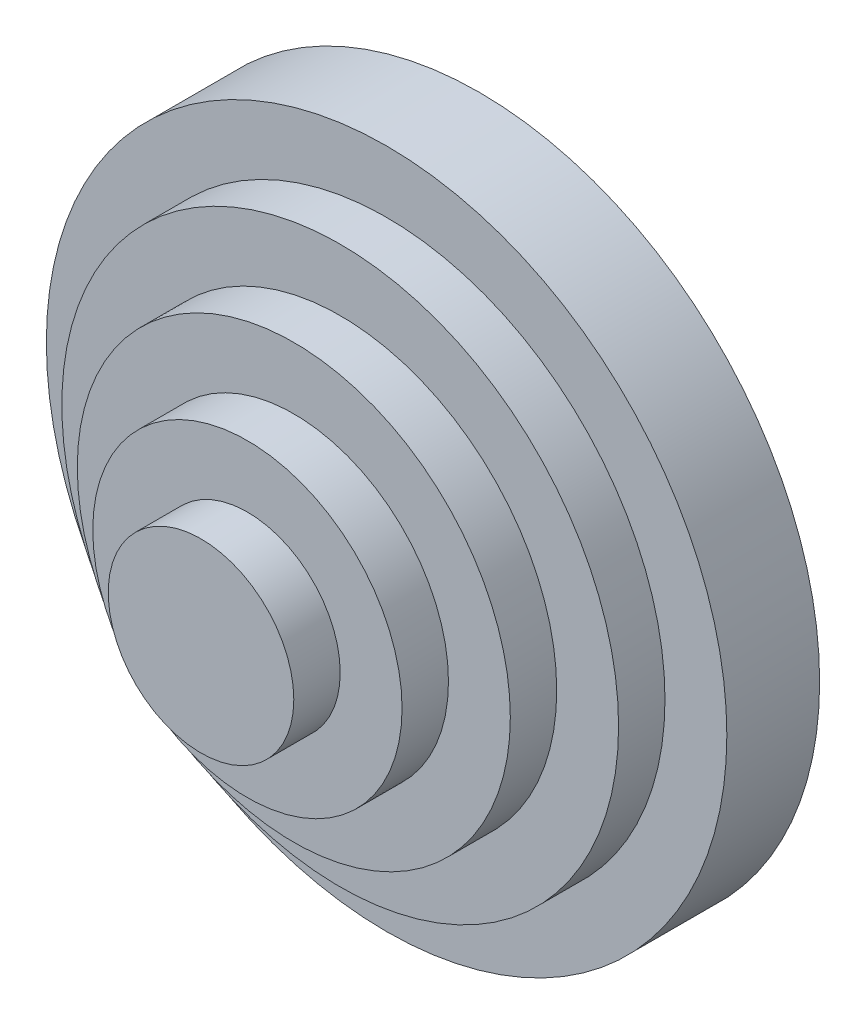
ISO-10303-21;
HEADER;
FILE_DESCRIPTION(('STEP AP214'),'2;1');
FILE_NAME('part.step','',(''),(''),'','','');
FILE_SCHEMA(('AUTOMOTIVE_DESIGN { 1 0 10303 214 1 1 1 1 }'));
ENDSEC;
DATA;
#1=APPLICATION_CONTEXT('core data for automotive mechanical design processes');
#2=APPLICATION_PROTOCOL_DEFINITION('international standard','automotive_design',2000,#1);
#3=PRODUCT_CONTEXT('',#1,'mechanical');
#4=PRODUCT('Part','Part','',(#3));
#5=PRODUCT_RELATED_PRODUCT_CATEGORY('part','',(#4));
#6=PRODUCT_DEFINITION_FORMATION('','',#4);
#7=PRODUCT_DEFINITION_CONTEXT('part definition',#1,'design');
#8=PRODUCT_DEFINITION('design','',#6,#7);
#9=PRODUCT_DEFINITION_SHAPE('','',#8);
#10=(LENGTH_UNIT() NAMED_UNIT(*) SI_UNIT(.MILLI.,.METRE.));
#11=(NAMED_UNIT(*) PLANE_ANGLE_UNIT() SI_UNIT($,.RADIAN.));
#12=(NAMED_UNIT(*) SI_UNIT($,.STERADIAN.) SOLID_ANGLE_UNIT());
#13=UNCERTAINTY_MEASURE_WITH_UNIT(LENGTH_MEASURE(1.E-05),#10,'distance_accuracy_value','');
#14=(GEOMETRIC_REPRESENTATION_CONTEXT(3) GLOBAL_UNCERTAINTY_ASSIGNED_CONTEXT((#13)) GLOBAL_UNIT_ASSIGNED_CONTEXT((#10,
#11,#12)) REPRESENTATION_CONTEXT('',''));
#15=CARTESIAN_POINT('',(0.,0.,0.));
#16=DIRECTION('',(0.,0.,1.));
#17=DIRECTION('',(1.,0.,0.));
#18=AXIS2_PLACEMENT_3D('',#15,#16,#17);
#19=CARTESIAN_POINT('',(0.,0.,-3.));
#20=DIRECTION('',(0.,0.,1.));
#21=DIRECTION('',(1.,0.,0.));
#22=AXIS2_PLACEMENT_3D('',#19,#20,#21);
#23=CYLINDRICAL_SURFACE('',#22,11.);
#24=CARTESIAN_POINT('',(0.,0.,-3.));
#25=DIRECTION('',(0.,0.,1.));
#26=DIRECTION('',(1.,0.,0.));
#27=AXIS2_PLACEMENT_3D('',#24,#25,#26);
#28=CIRCLE('',#27,11.);
#29=CARTESIAN_POINT('',(11.,0.,-3.));
#30=VERTEX_POINT('',#29);
#31=EDGE_CURVE('E163',#30,#30,#28,.T.);
#32=ORIENTED_EDGE('',*,*,#31,.T.);
#33=EDGE_LOOP('',(#32));
#34=FACE_BOUND('',#33,.T.);
#35=CARTESIAN_POINT('',(0.,0.,0.));
#36=DIRECTION('',(0.,0.,1.));
#37=DIRECTION('',(1.,0.,0.));
#38=AXIS2_PLACEMENT_3D('',#35,#36,#37);
#39=CIRCLE('',#38,11.);
#40=CARTESIAN_POINT('',(11.,0.,0.));
#41=VERTEX_POINT('',#40);
#42=EDGE_CURVE('E38',#41,#41,#39,.T.);
#43=ORIENTED_EDGE('',*,*,#42,.F.);
#44=EDGE_LOOP('',(#43));
#45=FACE_BOUND('',#44,.T.);
#46=ADVANCED_FACE('F35',(#34,#45),#23,.T.);
#47=CARTESIAN_POINT('',(0.,0.,-3.));
#48=DIRECTION('',(0.,0.,1.));
#49=DIRECTION('',(1.,0.,0.));
#50=AXIS2_PLACEMENT_3D('',#47,#48,#49);
#51=PLANE('',#50);
#52=DIRECTION('',(0.,1.,0.));
#53=VECTOR('',#52,1.);
#54=CARTESIAN_POINT('',(4.7,-2.22485954612874,-3.));
#55=LINE('',#54,#53);
#56=CARTESIAN_POINT('',(4.7,-2.22485954612874,-3.));
#57=VERTEX_POINT('',#56);
#58=CARTESIAN_POINT('',(4.7,2.22485954612874,-3.));
#59=VERTEX_POINT('',#58);
#60=EDGE_CURVE('E119',#57,#59,#55,.T.);
#61=ORIENTED_EDGE('',*,*,#60,.T.);
#62=CARTESIAN_POINT('',(0.,0.,-3.));
#63=DIRECTION('',(0.,0.,1.));
#64=DIRECTION('',(1.,0.,0.));
#65=AXIS2_PLACEMENT_3D('',#62,#63,#64);
#66=CIRCLE('',#65,5.20000000000002);
#67=CARTESIAN_POINT('',(2.22485954612874,4.7,-3.));
#68=VERTEX_POINT('',#67);
#69=EDGE_CURVE('E150',#59,#68,#66,.T.);
#70=ORIENTED_EDGE('',*,*,#69,.T.);
#71=DIRECTION('',(-1.,0.,0.));
#72=VECTOR('',#71,1.);
#73=CARTESIAN_POINT('',(2.22485954612874,4.7,-3.));
#74=LINE('',#73,#72);
#75=CARTESIAN_POINT('',(-2.22485954612874,4.7,-3.));
#76=VERTEX_POINT('',#75);
#77=EDGE_CURVE('E267',#68,#76,#74,.T.);
#78=ORIENTED_EDGE('',*,*,#77,.T.);
#79=CARTESIAN_POINT('',(0.,0.,-3.));
#80=DIRECTION('',(0.,0.,1.));
#81=DIRECTION('',(1.,0.,0.));
#82=AXIS2_PLACEMENT_3D('',#79,#80,#81);
#83=CIRCLE('',#82,5.20000000000002);
#84=CARTESIAN_POINT('',(-4.7,2.22485954612874,-3.));
#85=VERTEX_POINT('',#84);
#86=EDGE_CURVE('E51',#76,#85,#83,.T.);
#87=ORIENTED_EDGE('',*,*,#86,.T.);
#88=DIRECTION('',(0.,-1.,0.));
#89=VECTOR('',#88,1.);
#90=CARTESIAN_POINT('',(-4.7,2.22485954612874,-3.));
#91=LINE('',#90,#89);
#92=CARTESIAN_POINT('',(-4.7,-2.22485954612874,-3.));
#93=VERTEX_POINT('',#92);
#94=EDGE_CURVE('E127',#85,#93,#91,.T.);
#95=ORIENTED_EDGE('',*,*,#94,.T.);
#96=CARTESIAN_POINT('',(0.,0.,-3.));
#97=DIRECTION('',(0.,0.,1.));
#98=DIRECTION('',(1.,0.,0.));
#99=AXIS2_PLACEMENT_3D('',#96,#97,#98);
#100=CIRCLE('',#99,5.20000000000002);
#101=CARTESIAN_POINT('',(-2.22485954612874,-4.7,-3.));
#102=VERTEX_POINT('',#101);
#103=EDGE_CURVE('E125',#93,#102,#100,.T.);
#104=ORIENTED_EDGE('',*,*,#103,.T.);
#105=DIRECTION('',(1.,0.,0.));
#106=VECTOR('',#105,1.);
#107=CARTESIAN_POINT('',(-2.22485954612874,-4.7,-3.));
#108=LINE('',#107,#106);
#109=CARTESIAN_POINT('',(2.22485954612874,-4.7,-3.));
#110=VERTEX_POINT('',#109);
#111=EDGE_CURVE('E104',#102,#110,#108,.T.);
#112=ORIENTED_EDGE('',*,*,#111,.T.);
#113=CARTESIAN_POINT('',(0.,0.,-3.));
#114=DIRECTION('',(0.,0.,1.));
#115=DIRECTION('',(1.,0.,0.));
#116=AXIS2_PLACEMENT_3D('',#113,#114,#115);
#117=CIRCLE('',#116,5.20000000000002);
#118=EDGE_CURVE('E114',#110,#57,#117,.T.);
#119=ORIENTED_EDGE('',*,*,#118,.T.);
#120=EDGE_LOOP('',(#61,#70,#78,#87,#95,#104,#112,#119));
#121=FACE_BOUND('',#120,.T.);
#122=ORIENTED_EDGE('',*,*,#31,.F.);
#123=EDGE_LOOP('',(#122));
#124=FACE_BOUND('',#123,.T.);
#125=ADVANCED_FACE('F121',(#121,#124),#51,.F.);
#126=CARTESIAN_POINT('',(0.,0.,0.));
#127=DIRECTION('',(0.,0.,1.));
#128=DIRECTION('',(1.,0.,0.));
#129=AXIS2_PLACEMENT_3D('',#126,#127,#128);
#130=PLANE('',#129);
#131=CARTESIAN_POINT('',(0.,0.,0.));
#132=DIRECTION('',(0.,0.,1.));
#133=DIRECTION('',(1.,0.,0.));
#134=AXIS2_PLACEMENT_3D('',#131,#132,#133);
#135=CIRCLE('',#134,9.);
#136=CARTESIAN_POINT('',(9.,0.,0.));
#137=VERTEX_POINT('',#136);
#138=EDGE_CURVE('E165',#137,#137,#135,.T.);
#139=ORIENTED_EDGE('',*,*,#138,.F.);
#140=EDGE_LOOP('',(#139));
#141=FACE_BOUND('',#140,.T.);
#142=ORIENTED_EDGE('',*,*,#42,.T.);
#143=EDGE_LOOP('',(#142));
#144=FACE_BOUND('',#143,.T.);
#145=ADVANCED_FACE('F174',(#141,#144),#130,.T.);
#146=CARTESIAN_POINT('',(0.,0.,-3.));
#147=DIRECTION('',(0.,0.,1.));
#148=DIRECTION('',(1.,0.,0.));
#149=AXIS2_PLACEMENT_3D('',#146,#147,#148);
#150=CYLINDRICAL_SURFACE('',#149,5.20000000000002);
#151=CARTESIAN_POINT('',(0.,0.,0.));
#152=DIRECTION('',(0.,0.,1.));
#153=DIRECTION('',(1.,0.,0.));
#154=AXIS2_PLACEMENT_3D('',#151,#152,#153);
#155=CIRCLE('',#154,5.20000000000002);
#156=CARTESIAN_POINT('',(4.7,2.22485954612874,0.));
#157=VERTEX_POINT('',#156);
#158=CARTESIAN_POINT('',(2.22485954612874,4.7,0.));
#159=VERTEX_POINT('',#158);
#160=EDGE_CURVE('E83',#157,#159,#155,.T.);
#161=ORIENTED_EDGE('',*,*,#160,.T.);
#162=DIRECTION('',(0.,0.,1.));
#163=VECTOR('',#162,1.);
#164=CARTESIAN_POINT('',(2.22485954612874,4.7,-3.));
#165=LINE('',#164,#163);
#166=EDGE_CURVE('E132',#68,#159,#165,.T.);
#167=ORIENTED_EDGE('',*,*,#166,.F.);
#168=ORIENTED_EDGE('',*,*,#69,.F.);
#169=DIRECTION('',(0.,0.,1.));
#170=VECTOR('',#169,1.);
#171=CARTESIAN_POINT('',(4.7,2.22485954612874,-3.));
#172=LINE('',#171,#170);
#173=EDGE_CURVE('E60',#59,#157,#172,.T.);
#174=ORIENTED_EDGE('',*,*,#173,.T.);
#175=EDGE_LOOP('',(#161,#167,#168,#174));
#176=FACE_BOUND('',#175,.T.);
#177=ADVANCED_FACE('F184',(#176),#150,.F.);
#178=CARTESIAN_POINT('',(4.7,-2.22485954612874,-3.));
#179=DIRECTION('',(1.,0.,0.));
#180=DIRECTION('',(0.,1.,0.));
#181=AXIS2_PLACEMENT_3D('',#178,#179,#180);
#182=PLANE('',#181);
#183=DIRECTION('',(0.,1.,0.));
#184=VECTOR('',#183,1.);
#185=CARTESIAN_POINT('',(4.7,-2.22485954612874,0.));
#186=LINE('',#185,#184);
#187=CARTESIAN_POINT('',(4.7,-2.22485954612874,0.));
#188=VERTEX_POINT('',#187);
#189=EDGE_CURVE('E148',#188,#157,#186,.T.);
#190=ORIENTED_EDGE('',*,*,#189,.T.);
#191=ORIENTED_EDGE('',*,*,#173,.F.);
#192=ORIENTED_EDGE('',*,*,#60,.F.);
#193=DIRECTION('',(0.,0.,1.));
#194=VECTOR('',#193,1.);
#195=CARTESIAN_POINT('',(4.7,-2.22485954612874,-3.));
#196=LINE('',#195,#194);
#197=EDGE_CURVE('E110',#57,#188,#196,.T.);
#198=ORIENTED_EDGE('',*,*,#197,.T.);
#199=EDGE_LOOP('',(#190,#191,#192,#198));
#200=FACE_BOUND('',#199,.T.);
#201=ADVANCED_FACE('F189',(#200),#182,.F.);
#202=CARTESIAN_POINT('',(0.,0.,-3.));
#203=DIRECTION('',(0.,0.,1.));
#204=DIRECTION('',(1.,0.,0.));
#205=AXIS2_PLACEMENT_3D('',#202,#203,#204);
#206=CYLINDRICAL_SURFACE('',#205,5.20000000000002);
#207=CARTESIAN_POINT('',(0.,0.,0.));
#208=DIRECTION('',(0.,0.,1.));
#209=DIRECTION('',(1.,0.,0.));
#210=AXIS2_PLACEMENT_3D('',#207,#208,#209);
#211=CIRCLE('',#210,5.20000000000002);
#212=CARTESIAN_POINT('',(2.22485954612874,-4.7,0.));
#213=VERTEX_POINT('',#212);
#214=EDGE_CURVE('E146',#213,#188,#211,.T.);
#215=ORIENTED_EDGE('',*,*,#214,.T.);
#216=ORIENTED_EDGE('',*,*,#197,.F.);
#217=ORIENTED_EDGE('',*,*,#118,.F.);
#218=DIRECTION('',(0.,0.,1.));
#219=VECTOR('',#218,1.);
#220=CARTESIAN_POINT('',(2.22485954612874,-4.7,-3.));
#221=LINE('',#220,#219);
#222=EDGE_CURVE('E99',#110,#213,#221,.T.);
#223=ORIENTED_EDGE('',*,*,#222,.T.);
#224=EDGE_LOOP('',(#215,#216,#217,#223));
#225=FACE_BOUND('',#224,.T.);
#226=ADVANCED_FACE('F115',(#225),#206,.F.);
#227=CARTESIAN_POINT('',(-2.22485954612874,-4.7,-3.));
#228=DIRECTION('',(0.,-1.,0.));
#229=DIRECTION('',(1.,0.,0.));
#230=AXIS2_PLACEMENT_3D('',#227,#228,#229);
#231=PLANE('',#230);
#232=DIRECTION('',(1.,0.,0.));
#233=VECTOR('',#232,1.);
#234=CARTESIAN_POINT('',(-2.22485954612874,-4.7,0.));
#235=LINE('',#234,#233);
#236=CARTESIAN_POINT('',(-2.22485954612874,-4.7,0.));
#237=VERTEX_POINT('',#236);
#238=EDGE_CURVE('E107',#237,#213,#235,.T.);
#239=ORIENTED_EDGE('',*,*,#238,.T.);
#240=ORIENTED_EDGE('',*,*,#222,.F.);
#241=ORIENTED_EDGE('',*,*,#111,.F.);
#242=DIRECTION('',(0.,0.,1.));
#243=VECTOR('',#242,1.);
#244=CARTESIAN_POINT('',(-2.22485954612874,-4.7,-3.));
#245=LINE('',#244,#243);
#246=EDGE_CURVE('E111',#102,#237,#245,.T.);
#247=ORIENTED_EDGE('',*,*,#246,.T.);
#248=EDGE_LOOP('',(#239,#240,#241,#247));
#249=FACE_BOUND('',#248,.T.);
#250=ADVANCED_FACE('F101',(#249),#231,.F.);
#251=CARTESIAN_POINT('',(0.,0.,-3.));
#252=DIRECTION('',(0.,0.,1.));
#253=DIRECTION('',(1.,0.,0.));
#254=AXIS2_PLACEMENT_3D('',#251,#252,#253);
#255=CYLINDRICAL_SURFACE('',#254,5.20000000000002);
#256=CARTESIAN_POINT('',(0.,0.,0.));
#257=DIRECTION('',(0.,0.,1.));
#258=DIRECTION('',(1.,0.,0.));
#259=AXIS2_PLACEMENT_3D('',#256,#257,#258);
#260=CIRCLE('',#259,5.20000000000002);
#261=CARTESIAN_POINT('',(-4.7,-2.22485954612874,0.));
#262=VERTEX_POINT('',#261);
#263=EDGE_CURVE('E142',#262,#237,#260,.T.);
#264=ORIENTED_EDGE('',*,*,#263,.T.);
#265=ORIENTED_EDGE('',*,*,#246,.F.);
#266=ORIENTED_EDGE('',*,*,#103,.F.);
#267=DIRECTION('',(0.,0.,1.));
#268=VECTOR('',#267,1.);
#269=CARTESIAN_POINT('',(-4.7,-2.22485954612874,-3.));
#270=LINE('',#269,#268);
#271=EDGE_CURVE('E154',#93,#262,#270,.T.);
#272=ORIENTED_EDGE('',*,*,#271,.T.);
#273=EDGE_LOOP('',(#264,#265,#266,#272));
#274=FACE_BOUND('',#273,.T.);
#275=ADVANCED_FACE('F202',(#274),#255,.F.);
#276=CARTESIAN_POINT('',(-4.7,2.22485954612874,-3.));
#277=DIRECTION('',(-1.,0.,0.));
#278=DIRECTION('',(0.,0.,1.));
#279=AXIS2_PLACEMENT_3D('',#276,#277,#278);
#280=PLANE('',#279);
#281=DIRECTION('',(0.,-1.,0.));
#282=VECTOR('',#281,1.);
#283=CARTESIAN_POINT('',(-4.7,2.22485954612874,0.));
#284=LINE('',#283,#282);
#285=CARTESIAN_POINT('',(-4.7,2.22485954612874,0.));
#286=VERTEX_POINT('',#285);
#287=EDGE_CURVE('E139',#286,#262,#284,.T.);
#288=ORIENTED_EDGE('',*,*,#287,.T.);
#289=ORIENTED_EDGE('',*,*,#271,.F.);
#290=ORIENTED_EDGE('',*,*,#94,.F.);
#291=DIRECTION('',(0.,0.,1.));
#292=VECTOR('',#291,1.);
#293=CARTESIAN_POINT('',(-4.7,2.22485954612874,-3.));
#294=LINE('',#293,#292);
#295=EDGE_CURVE('E157',#85,#286,#294,.T.);
#296=ORIENTED_EDGE('',*,*,#295,.T.);
#297=EDGE_LOOP('',(#288,#289,#290,#296));
#298=FACE_BOUND('',#297,.T.);
#299=ADVANCED_FACE('F199',(#298),#280,.F.);
#300=CARTESIAN_POINT('',(0.,0.,-3.));
#301=DIRECTION('',(0.,0.,1.));
#302=DIRECTION('',(1.,0.,0.));
#303=AXIS2_PLACEMENT_3D('',#300,#301,#302);
#304=CYLINDRICAL_SURFACE('',#303,5.20000000000002);
#305=CARTESIAN_POINT('',(0.,0.,0.));
#306=DIRECTION('',(0.,0.,1.));
#307=DIRECTION('',(1.,0.,0.));
#308=AXIS2_PLACEMENT_3D('',#305,#306,#307);
#309=CIRCLE('',#308,5.20000000000002);
#310=CARTESIAN_POINT('',(-2.22485954612874,4.7,0.));
#311=VERTEX_POINT('',#310);
#312=EDGE_CURVE('E74',#311,#286,#309,.T.);
#313=ORIENTED_EDGE('',*,*,#312,.T.);
#314=ORIENTED_EDGE('',*,*,#295,.F.);
#315=ORIENTED_EDGE('',*,*,#86,.F.);
#316=DIRECTION('',(0.,0.,1.));
#317=VECTOR('',#316,1.);
#318=CARTESIAN_POINT('',(-2.22485954612874,4.7,-3.));
#319=LINE('',#318,#317);
#320=EDGE_CURVE('E160',#76,#311,#319,.T.);
#321=ORIENTED_EDGE('',*,*,#320,.T.);
#322=EDGE_LOOP('',(#313,#314,#315,#321));
#323=FACE_BOUND('',#322,.T.);
#324=ADVANCED_FACE('F195',(#323),#304,.F.);
#325=CARTESIAN_POINT('',(2.22485954612874,4.7,-3.));
#326=DIRECTION('',(0.,1.,0.));
#327=DIRECTION('',(-1.,0.,0.));
#328=AXIS2_PLACEMENT_3D('',#325,#326,#327);
#329=PLANE('',#328);
#330=DIRECTION('',(-1.,0.,0.));
#331=VECTOR('',#330,1.);
#332=CARTESIAN_POINT('',(2.22485954612874,4.7,0.));
#333=LINE('',#332,#331);
#334=EDGE_CURVE('E134',#159,#311,#333,.T.);
#335=ORIENTED_EDGE('',*,*,#334,.T.);
#336=ORIENTED_EDGE('',*,*,#320,.F.);
#337=ORIENTED_EDGE('',*,*,#77,.F.);
#338=ORIENTED_EDGE('',*,*,#166,.T.);
#339=EDGE_LOOP('',(#335,#336,#337,#338));
#340=FACE_BOUND('',#339,.T.);
#341=ADVANCED_FACE('F191',(#340),#329,.F.);
#342=CARTESIAN_POINT('',(0.,0.,1.5));
#343=DIRECTION('',(0.,0.,1.));
#344=DIRECTION('',(1.,0.,0.));
#345=AXIS2_PLACEMENT_3D('',#342,#343,#344);
#346=PLANE('',#345);
#347=CARTESIAN_POINT('',(0.,0.,1.5));
#348=DIRECTION('',(0.,0.,1.));
#349=DIRECTION('',(1.,0.,0.));
#350=AXIS2_PLACEMENT_3D('',#347,#348,#349);
#351=CIRCLE('',#350,7.);
#352=CARTESIAN_POINT('',(7.,0.,1.5));
#353=VERTEX_POINT('',#352);
#354=EDGE_CURVE('E169',#353,#353,#351,.T.);
#355=ORIENTED_EDGE('',*,*,#354,.F.);
#356=EDGE_LOOP('',(#355));
#357=FACE_BOUND('',#356,.T.);
#358=CARTESIAN_POINT('',(0.,0.,1.5));
#359=DIRECTION('',(0.,0.,1.));
#360=DIRECTION('',(1.,0.,0.));
#361=AXIS2_PLACEMENT_3D('',#358,#359,#360);
#362=CIRCLE('',#361,9.);
#363=CARTESIAN_POINT('',(9.,0.,1.5));
#364=VERTEX_POINT('',#363);
#365=EDGE_CURVE('E135',#364,#364,#362,.T.);
#366=ORIENTED_EDGE('',*,*,#365,.T.);
#367=EDGE_LOOP('',(#366));
#368=FACE_BOUND('',#367,.T.);
#369=ADVANCED_FACE('F194',(#357,#368),#346,.T.);
#370=CARTESIAN_POINT('',(0.,0.,1.5));
#371=DIRECTION('',(0.,0.,-1.));
#372=DIRECTION('',(-1.,0.,0.));
#373=AXIS2_PLACEMENT_3D('',#370,#371,#372);
#374=CYLINDRICAL_SURFACE('',#373,9.);
#375=ORIENTED_EDGE('',*,*,#365,.F.);
#376=EDGE_LOOP('',(#375));
#377=FACE_BOUND('',#376,.T.);
#378=ORIENTED_EDGE('',*,*,#138,.T.);
#379=EDGE_LOOP('',(#378));
#380=FACE_BOUND('',#379,.T.);
#381=ADVANCED_FACE('F213',(#377,#380),#374,.T.);
#382=CARTESIAN_POINT('',(0.,0.,0.));
#383=DIRECTION('',(0.,0.,1.));
#384=DIRECTION('',(1.,0.,0.));
#385=AXIS2_PLACEMENT_3D('',#382,#383,#384);
#386=PLANE('',#385);
#387=ORIENTED_EDGE('',*,*,#160,.F.);
#388=ORIENTED_EDGE('',*,*,#189,.F.);
#389=ORIENTED_EDGE('',*,*,#214,.F.);
#390=ORIENTED_EDGE('',*,*,#238,.F.);
#391=ORIENTED_EDGE('',*,*,#263,.F.);
#392=ORIENTED_EDGE('',*,*,#287,.F.);
#393=ORIENTED_EDGE('',*,*,#312,.F.);
#394=ORIENTED_EDGE('',*,*,#334,.F.);
#395=EDGE_LOOP('',(#387,#388,#389,#390,#391,#392,#393,#394));
#396=FACE_BOUND('',#395,.T.);
#397=ADVANCED_FACE('F216',(#396),#386,.F.);
#398=CARTESIAN_POINT('',(0.,0.,3.));
#399=DIRECTION('',(0.,0.,-1.));
#400=DIRECTION('',(-1.,0.,0.));
#401=AXIS2_PLACEMENT_3D('',#398,#399,#400);
#402=CYLINDRICAL_SURFACE('',#401,7.);
#403=CARTESIAN_POINT('',(0.,0.,3.));
#404=DIRECTION('',(0.,0.,1.));
#405=DIRECTION('',(1.,0.,0.));
#406=AXIS2_PLACEMENT_3D('',#403,#404,#405);
#407=CIRCLE('',#406,7.);
#408=CARTESIAN_POINT('',(7.,0.,3.));
#409=VERTEX_POINT('',#408);
#410=EDGE_CURVE('E254',#409,#409,#407,.T.);
#411=ORIENTED_EDGE('',*,*,#410,.F.);
#412=EDGE_LOOP('',(#411));
#413=FACE_BOUND('',#412,.T.);
#414=ORIENTED_EDGE('',*,*,#354,.T.);
#415=EDGE_LOOP('',(#414));
#416=FACE_BOUND('',#415,.T.);
#417=ADVANCED_FACE('F220',(#413,#416),#402,.T.);
#418=CARTESIAN_POINT('',(0.,0.,3.));
#419=DIRECTION('',(0.,0.,1.));
#420=DIRECTION('',(1.,0.,0.));
#421=AXIS2_PLACEMENT_3D('',#418,#419,#420);
#422=PLANE('',#421);
#423=CARTESIAN_POINT('',(0.,0.,3.));
#424=DIRECTION('',(0.,0.,1.));
#425=DIRECTION('',(1.,0.,0.));
#426=AXIS2_PLACEMENT_3D('',#423,#424,#425);
#427=CIRCLE('',#426,5.);
#428=CARTESIAN_POINT('',(5.,0.,3.));
#429=VERTEX_POINT('',#428);
#430=EDGE_CURVE('E43',#429,#429,#427,.T.);
#431=ORIENTED_EDGE('',*,*,#430,.F.);
#432=EDGE_LOOP('',(#431));
#433=FACE_BOUND('',#432,.T.);
#434=ORIENTED_EDGE('',*,*,#410,.T.);
#435=EDGE_LOOP('',(#434));
#436=FACE_BOUND('',#435,.T.);
#437=ADVANCED_FACE('F226',(#433,#436),#422,.T.);
#438=CARTESIAN_POINT('',(0.,0.,4.5));
#439=DIRECTION('',(0.,0.,-1.));
#440=DIRECTION('',(-1.,0.,0.));
#441=AXIS2_PLACEMENT_3D('',#438,#439,#440);
#442=CYLINDRICAL_SURFACE('',#441,5.);
#443=CARTESIAN_POINT('',(0.,0.,4.5));
#444=DIRECTION('',(0.,0.,1.));
#445=DIRECTION('',(1.,0.,0.));
#446=AXIS2_PLACEMENT_3D('',#443,#444,#445);
#447=CIRCLE('',#446,5.);
#448=CARTESIAN_POINT('',(5.,0.,4.5));
#449=VERTEX_POINT('',#448);
#450=EDGE_CURVE('E251',#449,#449,#447,.T.);
#451=ORIENTED_EDGE('',*,*,#450,.F.);
#452=EDGE_LOOP('',(#451));
#453=FACE_BOUND('',#452,.T.);
#454=ORIENTED_EDGE('',*,*,#430,.T.);
#455=EDGE_LOOP('',(#454));
#456=FACE_BOUND('',#455,.T.);
#457=ADVANCED_FACE('F230',(#453,#456),#442,.T.);
#458=CARTESIAN_POINT('',(0.,0.,4.5));
#459=DIRECTION('',(0.,0.,1.));
#460=DIRECTION('',(1.,0.,0.));
#461=AXIS2_PLACEMENT_3D('',#458,#459,#460);
#462=PLANE('',#461);
#463=CARTESIAN_POINT('',(0.,0.,4.5));
#464=DIRECTION('',(0.,0.,1.));
#465=DIRECTION('',(1.,0.,0.));
#466=AXIS2_PLACEMENT_3D('',#463,#464,#465);
#467=CIRCLE('',#466,3.);
#468=CARTESIAN_POINT('',(3.,0.,4.5));
#469=VERTEX_POINT('',#468);
#470=EDGE_CURVE('E11',#469,#469,#467,.T.);
#471=ORIENTED_EDGE('',*,*,#470,.F.);
#472=EDGE_LOOP('',(#471));
#473=FACE_BOUND('',#472,.T.);
#474=ORIENTED_EDGE('',*,*,#450,.T.);
#475=EDGE_LOOP('',(#474));
#476=FACE_BOUND('',#475,.T.);
#477=ADVANCED_FACE('F234',(#473,#476),#462,.T.);
#478=CARTESIAN_POINT('',(0.,0.,6.));
#479=DIRECTION('',(0.,0.,-1.));
#480=DIRECTION('',(-1.,0.,0.));
#481=AXIS2_PLACEMENT_3D('',#478,#479,#480);
#482=CYLINDRICAL_SURFACE('',#481,3.);
#483=CARTESIAN_POINT('',(0.,0.,6.));
#484=DIRECTION('',(0.,0.,1.));
#485=DIRECTION('',(1.,0.,0.));
#486=AXIS2_PLACEMENT_3D('',#483,#484,#485);
#487=CIRCLE('',#486,3.);
#488=CARTESIAN_POINT('',(3.,0.,6.));
#489=VERTEX_POINT('',#488);
#490=EDGE_CURVE('E250',#489,#489,#487,.T.);
#491=ORIENTED_EDGE('',*,*,#490,.F.);
#492=EDGE_LOOP('',(#491));
#493=FACE_BOUND('',#492,.T.);
#494=ORIENTED_EDGE('',*,*,#470,.T.);
#495=EDGE_LOOP('',(#494));
#496=FACE_BOUND('',#495,.T.);
#497=ADVANCED_FACE('F238',(#493,#496),#482,.T.);
#498=CARTESIAN_POINT('',(0.,0.,6.));
#499=DIRECTION('',(0.,0.,1.));
#500=DIRECTION('',(1.,0.,0.));
#501=AXIS2_PLACEMENT_3D('',#498,#499,#500);
#502=PLANE('',#501);
#503=ORIENTED_EDGE('',*,*,#490,.T.);
#504=EDGE_LOOP('',(#503));
#505=FACE_BOUND('',#504,.T.);
#506=ADVANCED_FACE('F242',(#505),#502,.T.);
#507=CLOSED_SHELL('',(#46,#125,#145,#177,#201,#226,#250,#275,#299,#324,#341,#369,#381,#397,#417,
#437,#457,#477,#497,#506));
#508=MANIFOLD_SOLID_BREP('B2',#507);
#509=ADVANCED_BREP_SHAPE_REPRESENTATION('',(#18,#508),#14);
#510=SHAPE_DEFINITION_REPRESENTATION(#9,#509);
ENDSEC;
END-ISO-10303-21;
